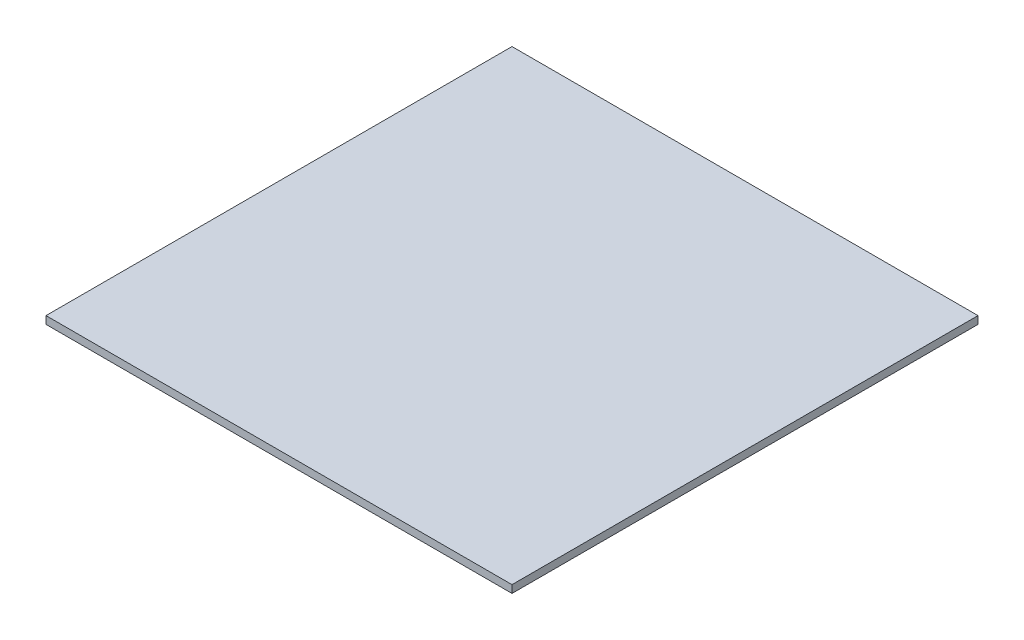
ISO-10303-21;
HEADER;
FILE_DESCRIPTION(('STEP AP214'),'2;1');
FILE_NAME('part.step','',(''),(''),'','','');
FILE_SCHEMA(('AUTOMOTIVE_DESIGN { 1 0 10303 214 1 1 1 1 }'));
ENDSEC;
DATA;
#1=APPLICATION_CONTEXT('core data for automotive mechanical design processes');
#2=APPLICATION_PROTOCOL_DEFINITION('international standard','automotive_design',2000,#1);
#3=PRODUCT_CONTEXT('',#1,'mechanical');
#4=PRODUCT('Part','Part','',(#3));
#5=PRODUCT_RELATED_PRODUCT_CATEGORY('part','',(#4));
#6=PRODUCT_DEFINITION_FORMATION('','',#4);
#7=PRODUCT_DEFINITION_CONTEXT('part definition',#1,'design');
#8=PRODUCT_DEFINITION('design','',#6,#7);
#9=PRODUCT_DEFINITION_SHAPE('','',#8);
#10=(LENGTH_UNIT() NAMED_UNIT(*) SI_UNIT(.MILLI.,.METRE.));
#11=(NAMED_UNIT(*) PLANE_ANGLE_UNIT() SI_UNIT($,.RADIAN.));
#12=(NAMED_UNIT(*) SI_UNIT($,.STERADIAN.) SOLID_ANGLE_UNIT());
#13=UNCERTAINTY_MEASURE_WITH_UNIT(LENGTH_MEASURE(1.E-05),#10,'distance_accuracy_value','');
#14=(GEOMETRIC_REPRESENTATION_CONTEXT(3) GLOBAL_UNCERTAINTY_ASSIGNED_CONTEXT((#13)) GLOBAL_UNIT_ASSIGNED_CONTEXT((#10,
#11,#12)) REPRESENTATION_CONTEXT('',''));
#15=CARTESIAN_POINT('',(0.,0.,0.));
#16=DIRECTION('',(0.,0.,1.));
#17=DIRECTION('',(1.,0.,0.));
#18=AXIS2_PLACEMENT_3D('',#15,#16,#17);
#19=CARTESIAN_POINT('',(610.,20.,-610.));
#20=DIRECTION('',(-1.,0.,0.));
#21=DIRECTION('',(0.,0.,1.));
#22=AXIS2_PLACEMENT_3D('',#19,#20,#21);
#23=PLANE('',#22);
#24=DIRECTION('',(0.,0.,-1.));
#25=VECTOR('',#24,1.);
#26=CARTESIAN_POINT('',(610.,0.,-610.));
#27=LINE('',#26,#25);
#28=CARTESIAN_POINT('',(610.,0.,610.));
#29=VERTEX_POINT('',#28);
#30=CARTESIAN_POINT('',(610.,0.,-610.));
#31=VERTEX_POINT('',#30);
#32=EDGE_CURVE('E97',#29,#31,#27,.T.);
#33=ORIENTED_EDGE('',*,*,#32,.T.);
#34=DIRECTION('',(0.,-1.,0.));
#35=VECTOR('',#34,1.);
#36=CARTESIAN_POINT('',(610.,20.,-610.));
#37=LINE('',#36,#35);
#38=CARTESIAN_POINT('',(610.,20.,-610.));
#39=VERTEX_POINT('',#38);
#40=EDGE_CURVE('E11',#39,#31,#37,.T.);
#41=ORIENTED_EDGE('',*,*,#40,.F.);
#42=DIRECTION('',(0.,0.,-1.));
#43=VECTOR('',#42,1.);
#44=CARTESIAN_POINT('',(610.,20.,-610.));
#45=LINE('',#44,#43);
#46=CARTESIAN_POINT('',(610.,20.,610.));
#47=VERTEX_POINT('',#46);
#48=EDGE_CURVE('E85',#47,#39,#45,.T.);
#49=ORIENTED_EDGE('',*,*,#48,.F.);
#50=DIRECTION('',(0.,-1.,0.));
#51=VECTOR('',#50,1.);
#52=CARTESIAN_POINT('',(610.,20.,610.));
#53=LINE('',#52,#51);
#54=EDGE_CURVE('E93',#47,#29,#53,.T.);
#55=ORIENTED_EDGE('',*,*,#54,.T.);
#56=EDGE_LOOP('',(#33,#41,#49,#55));
#57=FACE_BOUND('',#56,.T.);
#58=ADVANCED_FACE('F34',(#57),#23,.F.);
#59=CARTESIAN_POINT('',(-610.,20.,-610.));
#60=DIRECTION('',(0.,0.,1.));
#61=DIRECTION('',(1.,0.,0.));
#62=AXIS2_PLACEMENT_3D('',#59,#60,#61);
#63=PLANE('',#62);
#64=DIRECTION('',(-1.,0.,0.));
#65=VECTOR('',#64,1.);
#66=CARTESIAN_POINT('',(-610.,0.,-610.));
#67=LINE('',#66,#65);
#68=CARTESIAN_POINT('',(-610.,0.,-610.));
#69=VERTEX_POINT('',#68);
#70=EDGE_CURVE('E89',#31,#69,#67,.T.);
#71=ORIENTED_EDGE('',*,*,#70,.T.);
#72=DIRECTION('',(0.,-1.,0.));
#73=VECTOR('',#72,1.);
#74=CARTESIAN_POINT('',(-610.,20.,-610.));
#75=LINE('',#74,#73);
#76=CARTESIAN_POINT('',(-610.,20.,-610.));
#77=VERTEX_POINT('',#76);
#78=EDGE_CURVE('E42',#77,#69,#75,.T.);
#79=ORIENTED_EDGE('',*,*,#78,.F.);
#80=DIRECTION('',(-1.,0.,0.));
#81=VECTOR('',#80,1.);
#82=CARTESIAN_POINT('',(-610.,20.,-610.));
#83=LINE('',#82,#81);
#84=EDGE_CURVE('E80',#39,#77,#83,.T.);
#85=ORIENTED_EDGE('',*,*,#84,.F.);
#86=ORIENTED_EDGE('',*,*,#40,.T.);
#87=EDGE_LOOP('',(#71,#79,#85,#86));
#88=FACE_BOUND('',#87,.T.);
#89=ADVANCED_FACE('F88',(#88),#63,.F.);
#90=CARTESIAN_POINT('',(-610.,20.,-610.));
#91=DIRECTION('',(1.,0.,0.));
#92=DIRECTION('',(0.,0.,-1.));
#93=AXIS2_PLACEMENT_3D('',#90,#91,#92);
#94=PLANE('',#93);
#95=DIRECTION('',(0.,0.,1.));
#96=VECTOR('',#95,1.);
#97=CARTESIAN_POINT('',(-610.,0.,-610.));
#98=LINE('',#97,#96);
#99=CARTESIAN_POINT('',(-610.,0.,610.));
#100=VERTEX_POINT('',#99);
#101=EDGE_CURVE('E67',#69,#100,#98,.T.);
#102=ORIENTED_EDGE('',*,*,#101,.T.);
#103=DIRECTION('',(0.,-1.,0.));
#104=VECTOR('',#103,1.);
#105=CARTESIAN_POINT('',(-610.,20.,610.));
#106=LINE('',#105,#104);
#107=CARTESIAN_POINT('',(-610.,20.,610.));
#108=VERTEX_POINT('',#107);
#109=EDGE_CURVE('E90',#108,#100,#106,.T.);
#110=ORIENTED_EDGE('',*,*,#109,.F.);
#111=DIRECTION('',(0.,0.,1.));
#112=VECTOR('',#111,1.);
#113=CARTESIAN_POINT('',(-610.,20.,-610.));
#114=LINE('',#113,#112);
#115=EDGE_CURVE('E83',#77,#108,#114,.T.);
#116=ORIENTED_EDGE('',*,*,#115,.F.);
#117=ORIENTED_EDGE('',*,*,#78,.T.);
#118=EDGE_LOOP('',(#102,#110,#116,#117));
#119=FACE_BOUND('',#118,.T.);
#120=ADVANCED_FACE('F91',(#119),#94,.F.);
#121=CARTESIAN_POINT('',(-610.,20.,610.));
#122=DIRECTION('',(0.,0.,-1.));
#123=DIRECTION('',(-1.,0.,0.));
#124=AXIS2_PLACEMENT_3D('',#121,#122,#123);
#125=PLANE('',#124);
#126=DIRECTION('',(1.,0.,0.));
#127=VECTOR('',#126,1.);
#128=CARTESIAN_POINT('',(-610.,0.,610.));
#129=LINE('',#128,#127);
#130=EDGE_CURVE('E73',#100,#29,#129,.T.);
#131=ORIENTED_EDGE('',*,*,#130,.T.);
#132=ORIENTED_EDGE('',*,*,#54,.F.);
#133=DIRECTION('',(1.,0.,0.));
#134=VECTOR('',#133,1.);
#135=CARTESIAN_POINT('',(-610.,20.,610.));
#136=LINE('',#135,#134);
#137=EDGE_CURVE('E50',#108,#47,#136,.T.);
#138=ORIENTED_EDGE('',*,*,#137,.F.);
#139=ORIENTED_EDGE('',*,*,#109,.T.);
#140=EDGE_LOOP('',(#131,#132,#138,#139));
#141=FACE_BOUND('',#140,.T.);
#142=ADVANCED_FACE('F104',(#141),#125,.F.);
#143=CARTESIAN_POINT('',(0.,20.,0.));
#144=DIRECTION('',(0.,1.,0.));
#145=DIRECTION('',(0.,0.,1.));
#146=AXIS2_PLACEMENT_3D('',#143,#144,#145);
#147=PLANE('',#146);
#148=ORIENTED_EDGE('',*,*,#48,.T.);
#149=ORIENTED_EDGE('',*,*,#84,.T.);
#150=ORIENTED_EDGE('',*,*,#115,.T.);
#151=ORIENTED_EDGE('',*,*,#137,.T.);
#152=EDGE_LOOP('',(#148,#149,#150,#151));
#153=FACE_BOUND('',#152,.T.);
#154=ADVANCED_FACE('F81',(#153),#147,.T.);
#155=CARTESIAN_POINT('',(0.,0.,0.));
#156=DIRECTION('',(0.,1.,0.));
#157=DIRECTION('',(0.,0.,1.));
#158=AXIS2_PLACEMENT_3D('',#155,#156,#157);
#159=PLANE('',#158);
#160=ORIENTED_EDGE('',*,*,#32,.F.);
#161=ORIENTED_EDGE('',*,*,#130,.F.);
#162=ORIENTED_EDGE('',*,*,#101,.F.);
#163=ORIENTED_EDGE('',*,*,#70,.F.);
#164=EDGE_LOOP('',(#160,#161,#162,#163));
#165=FACE_BOUND('',#164,.T.);
#166=ADVANCED_FACE('F107',(#165),#159,.F.);
#167=CLOSED_SHELL('',(#58,#89,#120,#142,#154,#166));
#168=MANIFOLD_SOLID_BREP('B2',#167);
#169=ADVANCED_BREP_SHAPE_REPRESENTATION('',(#18,#168),#14);
#170=SHAPE_DEFINITION_REPRESENTATION(#9,#169);
ENDSEC;
END-ISO-10303-21;
